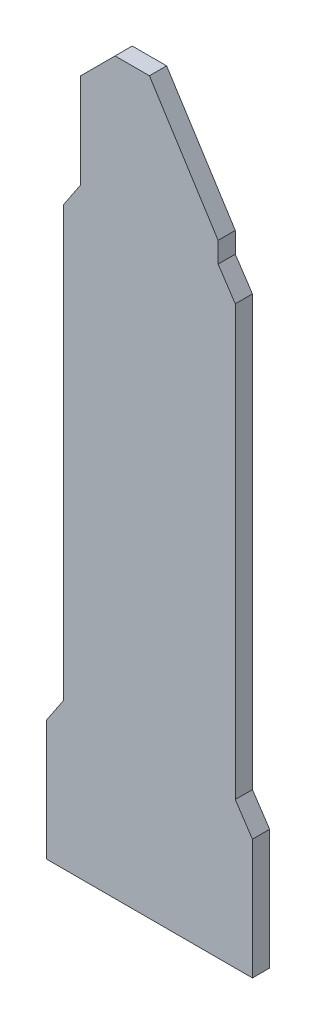
ISO-10303-21;
HEADER;
FILE_DESCRIPTION(('STEP AP214'),'2;1');
FILE_NAME('part.step','',(''),(''),'','','');
FILE_SCHEMA(('AUTOMOTIVE_DESIGN { 1 0 10303 214 1 1 1 1 }'));
ENDSEC;
DATA;
#1=APPLICATION_CONTEXT('core data for automotive mechanical design processes');
#2=APPLICATION_PROTOCOL_DEFINITION('international standard','automotive_design',2000,#1);
#3=PRODUCT_CONTEXT('',#1,'mechanical');
#4=PRODUCT('Part','Part','',(#3));
#5=PRODUCT_RELATED_PRODUCT_CATEGORY('part','',(#4));
#6=PRODUCT_DEFINITION_FORMATION('','',#4);
#7=PRODUCT_DEFINITION_CONTEXT('part definition',#1,'design');
#8=PRODUCT_DEFINITION('design','',#6,#7);
#9=PRODUCT_DEFINITION_SHAPE('','',#8);
#10=(LENGTH_UNIT() NAMED_UNIT(*) SI_UNIT(.MILLI.,.METRE.));
#11=(NAMED_UNIT(*) PLANE_ANGLE_UNIT() SI_UNIT($,.RADIAN.));
#12=(NAMED_UNIT(*) SI_UNIT($,.STERADIAN.) SOLID_ANGLE_UNIT());
#13=UNCERTAINTY_MEASURE_WITH_UNIT(LENGTH_MEASURE(1.E-05),#10,'distance_accuracy_value','');
#14=(GEOMETRIC_REPRESENTATION_CONTEXT(3) GLOBAL_UNCERTAINTY_ASSIGNED_CONTEXT((#13)) GLOBAL_UNIT_ASSIGNED_CONTEXT((#10,
#11,#12)) REPRESENTATION_CONTEXT('',''));
#15=CARTESIAN_POINT('',(0.,0.,0.));
#16=DIRECTION('',(0.,0.,1.));
#17=DIRECTION('',(1.,0.,0.));
#18=AXIS2_PLACEMENT_3D('',#15,#16,#17);
#19=CARTESIAN_POINT('',(1.27500000000002,1.25000000000002,0.1));
#20=DIRECTION('',(0.,0.,1.));
#21=DIRECTION('',(1.,0.,0.));
#22=AXIS2_PLACEMENT_3D('',#19,#20,#21);
#23=PLANE('',#22);
#24=DIRECTION('',(-0.554700196225227,-0.832050294337845,0.));
#25=VECTOR('',#24,1.);
#26=CARTESIAN_POINT('',(-2.125,2.35,0.1));
#27=LINE('',#26,#25);
#28=CARTESIAN_POINT('',(-2.125,2.35,0.1));
#29=VERTEX_POINT('',#28);
#30=CARTESIAN_POINT('',(-2.225,2.2,0.1));
#31=VERTEX_POINT('',#30);
#32=EDGE_CURVE('E130',#29,#31,#27,.T.);
#33=ORIENTED_EDGE('',*,*,#32,.T.);
#34=DIRECTION('',(0.,1.,0.));
#35=VECTOR('',#34,1.);
#36=CARTESIAN_POINT('',(-2.225,1.25000000000002,0.1));
#37=LINE('',#36,#35);
#38=CARTESIAN_POINT('',(-2.225,1.5,0.1));
#39=VERTEX_POINT('',#38);
#40=EDGE_CURVE('E115',#31,#39,#37,.F.);
#41=ORIENTED_EDGE('',*,*,#40,.T.);
#42=DIRECTION('',(1.,0.,0.));
#43=VECTOR('',#42,1.);
#44=CARTESIAN_POINT('',(1.27500000000002,1.5,0.1));
#45=LINE('',#44,#43);
#46=CARTESIAN_POINT('',(-1.025,1.5,0.1));
#47=VERTEX_POINT('',#46);
#48=EDGE_CURVE('E20',#39,#47,#45,.T.);
#49=ORIENTED_EDGE('',*,*,#48,.T.);
#50=DIRECTION('',(0.,1.,0.));
#51=VECTOR('',#50,1.);
#52=CARTESIAN_POINT('',(-1.025,1.25000000000002,0.1));
#53=LINE('',#52,#51);
#54=CARTESIAN_POINT('',(-1.025,2.2,0.1));
#55=VERTEX_POINT('',#54);
#56=EDGE_CURVE('E118',#47,#55,#53,.T.);
#57=ORIENTED_EDGE('',*,*,#56,.T.);
#58=DIRECTION('',(0.55470019622523,-0.832050294337843,0.));
#59=VECTOR('',#58,1.);
#60=CARTESIAN_POINT('',(-1.025,2.2,0.1));
#61=LINE('',#60,#59);
#62=CARTESIAN_POINT('',(-1.125,2.35,0.1));
#63=VERTEX_POINT('',#62);
#64=EDGE_CURVE('E134',#55,#63,#61,.F.);
#65=ORIENTED_EDGE('',*,*,#64,.T.);
#66=DIRECTION('',(0.,1.,0.));
#67=VECTOR('',#66,1.);
#68=CARTESIAN_POINT('',(-1.125,2.35,0.1));
#69=LINE('',#68,#67);
#70=CARTESIAN_POINT('',(-1.125,4.85,0.1));
#71=VERTEX_POINT('',#70);
#72=EDGE_CURVE('E139',#63,#71,#69,.T.);
#73=ORIENTED_EDGE('',*,*,#72,.T.);
#74=DIRECTION('',(0.554700196225235,-0.83205029433784,0.));
#75=VECTOR('',#74,1.);
#76=CARTESIAN_POINT('',(-1.225,5.,0.1));
#77=LINE('',#76,#75);
#78=CARTESIAN_POINT('',(-1.225,5.,0.1));
#79=VERTEX_POINT('',#78);
#80=EDGE_CURVE('E144',#71,#79,#77,.F.);
#81=ORIENTED_EDGE('',*,*,#80,.T.);
#82=DIRECTION('',(0.,1.,0.));
#83=VECTOR('',#82,1.);
#84=CARTESIAN_POINT('',(-1.225,5.75,0.1));
#85=LINE('',#84,#83);
#86=CARTESIAN_POINT('',(-1.225,5.12,0.1));
#87=VERTEX_POINT('',#86);
#88=EDGE_CURVE('E149',#79,#87,#85,.T.);
#89=ORIENTED_EDGE('',*,*,#88,.T.);
#90=DIRECTION('',(-0.536008136665273,0.844212815247804,0.));
#91=VECTOR('',#90,1.);
#92=CARTESIAN_POINT('',(-1.225,5.12,0.1));
#93=LINE('',#92,#91);
#94=CARTESIAN_POINT('',(-1.625,5.75,0.1));
#95=VERTEX_POINT('',#94);
#96=EDGE_CURVE('E152',#95,#87,#93,.F.);
#97=ORIENTED_EDGE('',*,*,#96,.F.);
#98=DIRECTION('',(1.,0.,0.));
#99=VECTOR('',#98,1.);
#100=CARTESIAN_POINT('',(-2.025,5.75,0.1));
#101=LINE('',#100,#99);
#102=CARTESIAN_POINT('',(-1.825,5.75,0.1));
#103=VERTEX_POINT('',#102);
#104=EDGE_CURVE('E159',#95,#103,#101,.F.);
#105=ORIENTED_EDGE('',*,*,#104,.T.);
#106=DIRECTION('',(0.707106781186548,0.707106781186547,0.));
#107=VECTOR('',#106,1.);
#108=CARTESIAN_POINT('',(-2.025,5.55,0.1));
#109=LINE('',#108,#107);
#110=CARTESIAN_POINT('',(-2.025,5.55,0.1));
#111=VERTEX_POINT('',#110);
#112=EDGE_CURVE('E164',#103,#111,#109,.F.);
#113=ORIENTED_EDGE('',*,*,#112,.T.);
#114=DIRECTION('',(0.,1.,0.));
#115=VECTOR('',#114,1.);
#116=CARTESIAN_POINT('',(-2.025,5.,0.1));
#117=LINE('',#116,#115);
#118=CARTESIAN_POINT('',(-2.025,5.,0.1));
#119=VERTEX_POINT('',#118);
#120=EDGE_CURVE('E169',#111,#119,#117,.F.);
#121=ORIENTED_EDGE('',*,*,#120,.T.);
#122=DIRECTION('',(0.55470019622523,0.832050294337843,0.));
#123=VECTOR('',#122,1.);
#124=CARTESIAN_POINT('',(-2.125,4.85,0.1));
#125=LINE('',#124,#123);
#126=CARTESIAN_POINT('',(-2.125,4.85,0.1));
#127=VERTEX_POINT('',#126);
#128=EDGE_CURVE('E174',#119,#127,#125,.F.);
#129=ORIENTED_EDGE('',*,*,#128,.T.);
#130=DIRECTION('',(0.,1.,0.));
#131=VECTOR('',#130,1.);
#132=CARTESIAN_POINT('',(-2.125,4.85,0.1));
#133=LINE('',#132,#131);
#134=EDGE_CURVE('E179',#127,#29,#133,.F.);
#135=ORIENTED_EDGE('',*,*,#134,.T.);
#136=EDGE_LOOP('',(#33,#41,#49,#57,#65,#73,#81,#89,#97,#105,#113,#121,#129,#135));
#137=FACE_BOUND('',#136,.T.);
#138=ADVANCED_FACE('F17',(#137),#23,.T.);
#139=CARTESIAN_POINT('',(-1.025,2.2,0.1));
#140=DIRECTION('',(-0.832050294337843,-0.55470019622523,0.));
#141=DIRECTION('',(0.55470019622523,-0.832050294337843,0.));
#142=AXIS2_PLACEMENT_3D('',#139,#140,#141);
#143=PLANE('',#142);
#144=DIRECTION('',(0.,0.,1.));
#145=VECTOR('',#144,1.);
#146=CARTESIAN_POINT('',(-1.125,2.35,0.1));
#147=LINE('',#146,#145);
#148=CARTESIAN_POINT('',(-1.125,2.35,0.));
#149=VERTEX_POINT('',#148);
#150=EDGE_CURVE('E136',#149,#63,#147,.T.);
#151=ORIENTED_EDGE('',*,*,#150,.T.);
#152=ORIENTED_EDGE('',*,*,#64,.F.);
#153=DIRECTION('',(0.,0.,1.));
#154=VECTOR('',#153,1.);
#155=CARTESIAN_POINT('',(-1.025,2.2,0.1));
#156=LINE('',#155,#154);
#157=CARTESIAN_POINT('',(-1.025,2.2,0.));
#158=VERTEX_POINT('',#157);
#159=EDGE_CURVE('E125',#55,#158,#156,.F.);
#160=ORIENTED_EDGE('',*,*,#159,.T.);
#161=DIRECTION('',(-0.55470019622523,0.832050294337843,0.));
#162=VECTOR('',#161,1.);
#163=CARTESIAN_POINT('',(-1.025,2.2,0.));
#164=LINE('',#163,#162);
#165=EDGE_CURVE('E124',#158,#149,#164,.T.);
#166=ORIENTED_EDGE('',*,*,#165,.T.);
#167=EDGE_LOOP('',(#151,#152,#160,#166));
#168=FACE_BOUND('',#167,.T.);
#169=ADVANCED_FACE('F271',(#168),#143,.F.);
#170=CARTESIAN_POINT('',(-1.125,2.35,0.1));
#171=DIRECTION('',(-1.,0.,0.));
#172=DIRECTION('',(0.,0.,1.));
#173=AXIS2_PLACEMENT_3D('',#170,#171,#172);
#174=PLANE('',#173);
#175=DIRECTION('',(0.,0.,1.));
#176=VECTOR('',#175,1.);
#177=CARTESIAN_POINT('',(-1.125,4.85,0.1));
#178=LINE('',#177,#176);
#179=CARTESIAN_POINT('',(-1.125,4.85,0.));
#180=VERTEX_POINT('',#179);
#181=EDGE_CURVE('E141',#180,#71,#178,.T.);
#182=ORIENTED_EDGE('',*,*,#181,.T.);
#183=ORIENTED_EDGE('',*,*,#72,.F.);
#184=ORIENTED_EDGE('',*,*,#150,.F.);
#185=DIRECTION('',(0.,1.,0.));
#186=VECTOR('',#185,1.);
#187=CARTESIAN_POINT('',(-1.125,1.25000000000002,0.));
#188=LINE('',#187,#186);
#189=EDGE_CURVE('E193',#149,#180,#188,.T.);
#190=ORIENTED_EDGE('',*,*,#189,.T.);
#191=EDGE_LOOP('',(#182,#183,#184,#190));
#192=FACE_BOUND('',#191,.T.);
#193=ADVANCED_FACE('F269',(#192),#174,.F.);
#194=CARTESIAN_POINT('',(-1.225,5.,0.1));
#195=DIRECTION('',(-0.83205029433784,-0.554700196225235,0.));
#196=DIRECTION('',(0.554700196225235,-0.83205029433784,0.));
#197=AXIS2_PLACEMENT_3D('',#194,#195,#196);
#198=PLANE('',#197);
#199=DIRECTION('',(0.,0.,1.));
#200=VECTOR('',#199,1.);
#201=CARTESIAN_POINT('',(-1.225,5.,0.1));
#202=LINE('',#201,#200);
#203=CARTESIAN_POINT('',(-1.225,5.,0.));
#204=VERTEX_POINT('',#203);
#205=EDGE_CURVE('E146',#204,#79,#202,.T.);
#206=ORIENTED_EDGE('',*,*,#205,.T.);
#207=ORIENTED_EDGE('',*,*,#80,.F.);
#208=ORIENTED_EDGE('',*,*,#181,.F.);
#209=DIRECTION('',(-0.554700196225229,0.832050294337844,0.));
#210=VECTOR('',#209,1.);
#211=CARTESIAN_POINT('',(-1.125,4.85,0.));
#212=LINE('',#211,#210);
#213=EDGE_CURVE('E196',#180,#204,#212,.T.);
#214=ORIENTED_EDGE('',*,*,#213,.T.);
#215=EDGE_LOOP('',(#206,#207,#208,#214));
#216=FACE_BOUND('',#215,.T.);
#217=ADVANCED_FACE('F265',(#216),#198,.F.);
#218=CARTESIAN_POINT('',(-1.225,5.75,0.1));
#219=DIRECTION('',(-1.,0.,0.));
#220=DIRECTION('',(0.,0.,1.));
#221=AXIS2_PLACEMENT_3D('',#218,#219,#220);
#222=PLANE('',#221);
#223=ORIENTED_EDGE('',*,*,#88,.F.);
#224=ORIENTED_EDGE('',*,*,#205,.F.);
#225=DIRECTION('',(0.,1.,0.));
#226=VECTOR('',#225,1.);
#227=CARTESIAN_POINT('',(-1.225,1.25000000000002,0.));
#228=LINE('',#227,#226);
#229=CARTESIAN_POINT('',(-1.225,5.12,0.));
#230=VERTEX_POINT('',#229);
#231=EDGE_CURVE('E199',#204,#230,#228,.T.);
#232=ORIENTED_EDGE('',*,*,#231,.T.);
#233=DIRECTION('',(0.,0.,1.));
#234=VECTOR('',#233,1.);
#235=CARTESIAN_POINT('',(-1.225,5.12,-6.25));
#236=LINE('',#235,#234);
#237=EDGE_CURVE('E154',#87,#230,#236,.F.);
#238=ORIENTED_EDGE('',*,*,#237,.F.);
#239=EDGE_LOOP('',(#223,#224,#232,#238));
#240=FACE_BOUND('',#239,.T.);
#241=ADVANCED_FACE('F261',(#240),#222,.F.);
#242=CARTESIAN_POINT('',(-1.225,5.12,-6.25));
#243=DIRECTION('',(0.844212815247804,0.536008136665273,0.));
#244=DIRECTION('',(-0.536008136665273,0.844212815247804,0.));
#245=AXIS2_PLACEMENT_3D('',#242,#243,#244);
#246=PLANE('',#245);
#247=ORIENTED_EDGE('',*,*,#96,.T.);
#248=ORIENTED_EDGE('',*,*,#237,.T.);
#249=DIRECTION('',(-0.536008136665272,0.844212815247804,0.));
#250=VECTOR('',#249,1.);
#251=CARTESIAN_POINT('',(-1.225,5.12,0.));
#252=LINE('',#251,#250);
#253=CARTESIAN_POINT('',(-1.625,5.75,0.));
#254=VERTEX_POINT('',#253);
#255=EDGE_CURVE('E202',#230,#254,#252,.T.);
#256=ORIENTED_EDGE('',*,*,#255,.T.);
#257=DIRECTION('',(0.,0.,-1.));
#258=VECTOR('',#257,1.);
#259=CARTESIAN_POINT('',(-1.625,5.75,0.1));
#260=LINE('',#259,#258);
#261=EDGE_CURVE('E156',#254,#95,#260,.F.);
#262=ORIENTED_EDGE('',*,*,#261,.T.);
#263=EDGE_LOOP('',(#247,#248,#256,#262));
#264=FACE_BOUND('',#263,.T.);
#265=ADVANCED_FACE('F257',(#264),#246,.T.);
#266=CARTESIAN_POINT('',(-2.025,5.75,0.1));
#267=DIRECTION('',(0.,-1.,0.));
#268=DIRECTION('',(0.,0.,-1.));
#269=AXIS2_PLACEMENT_3D('',#266,#267,#268);
#270=PLANE('',#269);
#271=DIRECTION('',(0.,0.,1.));
#272=VECTOR('',#271,1.);
#273=CARTESIAN_POINT('',(-1.825,5.75,0.1));
#274=LINE('',#273,#272);
#275=CARTESIAN_POINT('',(-1.825,5.75,0.));
#276=VERTEX_POINT('',#275);
#277=EDGE_CURVE('E161',#276,#103,#274,.T.);
#278=ORIENTED_EDGE('',*,*,#277,.T.);
#279=ORIENTED_EDGE('',*,*,#104,.F.);
#280=ORIENTED_EDGE('',*,*,#261,.F.);
#281=DIRECTION('',(1.,0.,0.));
#282=VECTOR('',#281,1.);
#283=CARTESIAN_POINT('',(1.27500000000002,5.75,0.));
#284=LINE('',#283,#282);
#285=EDGE_CURVE('E205',#254,#276,#284,.F.);
#286=ORIENTED_EDGE('',*,*,#285,.T.);
#287=EDGE_LOOP('',(#278,#279,#280,#286));
#288=FACE_BOUND('',#287,.T.);
#289=ADVANCED_FACE('F253',(#288),#270,.F.);
#290=CARTESIAN_POINT('',(-2.025,5.55,0.1));
#291=DIRECTION('',(0.707106781186547,-0.707106781186548,0.));
#292=DIRECTION('',(0.707106781186548,0.707106781186547,0.));
#293=AXIS2_PLACEMENT_3D('',#290,#291,#292);
#294=PLANE('',#293);
#295=ORIENTED_EDGE('',*,*,#277,.F.);
#296=DIRECTION('',(-0.707106781186548,-0.707106781186547,0.));
#297=VECTOR('',#296,1.);
#298=CARTESIAN_POINT('',(-1.825,5.75,0.));
#299=LINE('',#298,#297);
#300=CARTESIAN_POINT('',(-2.025,5.55,0.));
#301=VERTEX_POINT('',#300);
#302=EDGE_CURVE('E208',#276,#301,#299,.T.);
#303=ORIENTED_EDGE('',*,*,#302,.T.);
#304=DIRECTION('',(0.,0.,-1.));
#305=VECTOR('',#304,1.);
#306=CARTESIAN_POINT('',(-2.025,5.55,0.1));
#307=LINE('',#306,#305);
#308=EDGE_CURVE('E166',#301,#111,#307,.F.);
#309=ORIENTED_EDGE('',*,*,#308,.T.);
#310=ORIENTED_EDGE('',*,*,#112,.F.);
#311=EDGE_LOOP('',(#295,#303,#309,#310));
#312=FACE_BOUND('',#311,.T.);
#313=ADVANCED_FACE('F249',(#312),#294,.F.);
#314=CARTESIAN_POINT('',(-2.025,5.,0.1));
#315=DIRECTION('',(1.,0.,0.));
#316=DIRECTION('',(0.,0.,-1.));
#317=AXIS2_PLACEMENT_3D('',#314,#315,#316);
#318=PLANE('',#317);
#319=ORIENTED_EDGE('',*,*,#308,.F.);
#320=DIRECTION('',(0.,1.,0.));
#321=VECTOR('',#320,1.);
#322=CARTESIAN_POINT('',(-2.025,1.25000000000002,0.));
#323=LINE('',#322,#321);
#324=CARTESIAN_POINT('',(-2.025,5.,0.));
#325=VERTEX_POINT('',#324);
#326=EDGE_CURVE('E211',#301,#325,#323,.F.);
#327=ORIENTED_EDGE('',*,*,#326,.T.);
#328=DIRECTION('',(0.,0.,1.));
#329=VECTOR('',#328,1.);
#330=CARTESIAN_POINT('',(-2.025,5.,0.1));
#331=LINE('',#330,#329);
#332=EDGE_CURVE('E171',#325,#119,#331,.T.);
#333=ORIENTED_EDGE('',*,*,#332,.T.);
#334=ORIENTED_EDGE('',*,*,#120,.F.);
#335=EDGE_LOOP('',(#319,#327,#333,#334));
#336=FACE_BOUND('',#335,.T.);
#337=ADVANCED_FACE('F245',(#336),#318,.F.);
#338=CARTESIAN_POINT('',(-2.125,4.85,0.1));
#339=DIRECTION('',(0.832050294337843,-0.55470019622523,0.));
#340=DIRECTION('',(0.55470019622523,0.832050294337843,0.));
#341=AXIS2_PLACEMENT_3D('',#338,#339,#340);
#342=PLANE('',#341);
#343=DIRECTION('',(0.,0.,1.));
#344=VECTOR('',#343,1.);
#345=CARTESIAN_POINT('',(-2.125,4.85,0.1));
#346=LINE('',#345,#344);
#347=CARTESIAN_POINT('',(-2.125,4.85,0.));
#348=VERTEX_POINT('',#347);
#349=EDGE_CURVE('E176',#348,#127,#346,.T.);
#350=ORIENTED_EDGE('',*,*,#349,.T.);
#351=ORIENTED_EDGE('',*,*,#128,.F.);
#352=ORIENTED_EDGE('',*,*,#332,.F.);
#353=DIRECTION('',(-0.55470019622523,-0.832050294337843,0.));
#354=VECTOR('',#353,1.);
#355=CARTESIAN_POINT('',(-2.025,5.,0.));
#356=LINE('',#355,#354);
#357=EDGE_CURVE('E214',#325,#348,#356,.T.);
#358=ORIENTED_EDGE('',*,*,#357,.T.);
#359=EDGE_LOOP('',(#350,#351,#352,#358));
#360=FACE_BOUND('',#359,.T.);
#361=ADVANCED_FACE('F241',(#360),#342,.F.);
#362=CARTESIAN_POINT('',(-2.125,4.85,0.1));
#363=DIRECTION('',(1.,0.,0.));
#364=DIRECTION('',(0.,1.,0.));
#365=AXIS2_PLACEMENT_3D('',#362,#363,#364);
#366=PLANE('',#365);
#367=DIRECTION('',(0.,0.,1.));
#368=VECTOR('',#367,1.);
#369=CARTESIAN_POINT('',(-2.125,2.35,0.1));
#370=LINE('',#369,#368);
#371=CARTESIAN_POINT('',(-2.125,2.35,0.));
#372=VERTEX_POINT('',#371);
#373=EDGE_CURVE('E182',#372,#29,#370,.T.);
#374=ORIENTED_EDGE('',*,*,#373,.T.);
#375=ORIENTED_EDGE('',*,*,#134,.F.);
#376=ORIENTED_EDGE('',*,*,#349,.F.);
#377=DIRECTION('',(0.,1.,0.));
#378=VECTOR('',#377,1.);
#379=CARTESIAN_POINT('',(-2.125,1.25000000000002,0.));
#380=LINE('',#379,#378);
#381=EDGE_CURVE('E217',#348,#372,#380,.F.);
#382=ORIENTED_EDGE('',*,*,#381,.T.);
#383=EDGE_LOOP('',(#374,#375,#376,#382));
#384=FACE_BOUND('',#383,.T.);
#385=ADVANCED_FACE('F237',(#384),#366,.F.);
#386=CARTESIAN_POINT('',(-2.125,2.35,0.1));
#387=DIRECTION('',(0.832050294337841,-0.554700196225233,0.));
#388=DIRECTION('',(0.554700196225233,0.832050294337841,0.));
#389=AXIS2_PLACEMENT_3D('',#386,#387,#388);
#390=PLANE('',#389);
#391=DIRECTION('',(0.,0.,1.));
#392=VECTOR('',#391,1.);
#393=CARTESIAN_POINT('',(-2.225,2.2,0.1));
#394=LINE('',#393,#392);
#395=CARTESIAN_POINT('',(-2.225,2.2,0.));
#396=VERTEX_POINT('',#395);
#397=EDGE_CURVE('E185',#396,#31,#394,.T.);
#398=ORIENTED_EDGE('',*,*,#397,.T.);
#399=ORIENTED_EDGE('',*,*,#32,.F.);
#400=ORIENTED_EDGE('',*,*,#373,.F.);
#401=DIRECTION('',(-0.554700196225227,-0.832050294337845,0.));
#402=VECTOR('',#401,1.);
#403=CARTESIAN_POINT('',(-2.125,2.35,0.));
#404=LINE('',#403,#402);
#405=EDGE_CURVE('E220',#372,#396,#404,.T.);
#406=ORIENTED_EDGE('',*,*,#405,.T.);
#407=EDGE_LOOP('',(#398,#399,#400,#406));
#408=FACE_BOUND('',#407,.T.);
#409=ADVANCED_FACE('F234',(#408),#390,.F.);
#410=CARTESIAN_POINT('',(-2.225,2.2,0.1));
#411=DIRECTION('',(1.,0.,0.));
#412=DIRECTION('',(0.,1.,0.));
#413=AXIS2_PLACEMENT_3D('',#410,#411,#412);
#414=PLANE('',#413);
#415=DIRECTION('',(0.,0.,1.));
#416=VECTOR('',#415,1.);
#417=CARTESIAN_POINT('',(-2.225,1.5,-0.359021698729691));
#418=LINE('',#417,#416);
#419=CARTESIAN_POINT('',(-2.225,1.5,0.));
#420=VERTEX_POINT('',#419);
#421=EDGE_CURVE('E188',#420,#39,#418,.T.);
#422=ORIENTED_EDGE('',*,*,#421,.T.);
#423=ORIENTED_EDGE('',*,*,#40,.F.);
#424=ORIENTED_EDGE('',*,*,#397,.F.);
#425=DIRECTION('',(0.,1.,0.));
#426=VECTOR('',#425,1.);
#427=CARTESIAN_POINT('',(-2.225,1.25000000000002,0.));
#428=LINE('',#427,#426);
#429=EDGE_CURVE('E223',#396,#420,#428,.F.);
#430=ORIENTED_EDGE('',*,*,#429,.T.);
#431=EDGE_LOOP('',(#422,#423,#424,#430));
#432=FACE_BOUND('',#431,.T.);
#433=ADVANCED_FACE('F228',(#432),#414,.F.);
#434=CARTESIAN_POINT('',(3.1539367816092,1.5,-0.359021698729691));
#435=DIRECTION('',(0.,1.,0.));
#436=DIRECTION('',(0.,0.,1.));
#437=AXIS2_PLACEMENT_3D('',#434,#435,#436);
#438=PLANE('',#437);
#439=DIRECTION('',(0.,0.,1.));
#440=VECTOR('',#439,1.);
#441=CARTESIAN_POINT('',(-1.025,1.5,0.1));
#442=LINE('',#441,#440);
#443=CARTESIAN_POINT('',(-1.025,1.5,0.));
#444=VERTEX_POINT('',#443);
#445=EDGE_CURVE('E34',#444,#47,#442,.T.);
#446=ORIENTED_EDGE('',*,*,#445,.T.);
#447=ORIENTED_EDGE('',*,*,#48,.F.);
#448=ORIENTED_EDGE('',*,*,#421,.F.);
#449=DIRECTION('',(1.,0.,0.));
#450=VECTOR('',#449,1.);
#451=CARTESIAN_POINT('',(1.27500000000002,1.5,0.));
#452=LINE('',#451,#450);
#453=EDGE_CURVE('E26',#420,#444,#452,.T.);
#454=ORIENTED_EDGE('',*,*,#453,.T.);
#455=EDGE_LOOP('',(#446,#447,#448,#454));
#456=FACE_BOUND('',#455,.T.);
#457=ADVANCED_FACE('F122',(#456),#438,.F.);
#458=CARTESIAN_POINT('',(-1.025,-0.15,0.1));
#459=DIRECTION('',(-1.,0.,0.));
#460=DIRECTION('',(0.,-1.,0.));
#461=AXIS2_PLACEMENT_3D('',#458,#459,#460);
#462=PLANE('',#461);
#463=ORIENTED_EDGE('',*,*,#445,.F.);
#464=DIRECTION('',(0.,1.,0.));
#465=VECTOR('',#464,1.);
#466=CARTESIAN_POINT('',(-1.025,1.25000000000002,0.));
#467=LINE('',#466,#465);
#468=EDGE_CURVE('E11',#444,#158,#467,.T.);
#469=ORIENTED_EDGE('',*,*,#468,.T.);
#470=ORIENTED_EDGE('',*,*,#159,.F.);
#471=ORIENTED_EDGE('',*,*,#56,.F.);
#472=EDGE_LOOP('',(#463,#469,#470,#471));
#473=FACE_BOUND('',#472,.T.);
#474=ADVANCED_FACE('F128',(#473),#462,.F.);
#475=CARTESIAN_POINT('',(1.27500000000002,1.25000000000002,0.));
#476=DIRECTION('',(0.,0.,1.));
#477=DIRECTION('',(1.,0.,0.));
#478=AXIS2_PLACEMENT_3D('',#475,#476,#477);
#479=PLANE('',#478);
#480=ORIENTED_EDGE('',*,*,#453,.F.);
#481=ORIENTED_EDGE('',*,*,#429,.F.);
#482=ORIENTED_EDGE('',*,*,#405,.F.);
#483=ORIENTED_EDGE('',*,*,#381,.F.);
#484=ORIENTED_EDGE('',*,*,#357,.F.);
#485=ORIENTED_EDGE('',*,*,#326,.F.);
#486=ORIENTED_EDGE('',*,*,#302,.F.);
#487=ORIENTED_EDGE('',*,*,#285,.F.);
#488=ORIENTED_EDGE('',*,*,#255,.F.);
#489=ORIENTED_EDGE('',*,*,#231,.F.);
#490=ORIENTED_EDGE('',*,*,#213,.F.);
#491=ORIENTED_EDGE('',*,*,#189,.F.);
#492=ORIENTED_EDGE('',*,*,#165,.F.);
#493=ORIENTED_EDGE('',*,*,#468,.F.);
#494=EDGE_LOOP('',(#480,#481,#482,#483,#484,#485,#486,#487,#488,#489,#490,#491,#492,#493));
#495=FACE_BOUND('',#494,.T.);
#496=ADVANCED_FACE('F231',(#495),#479,.F.);
#497=CLOSED_SHELL('',(#138,#169,#193,#217,#241,#265,#289,#313,#337,#361,#385,#409,#433,#457,
#474,#496));
#498=MANIFOLD_SOLID_BREP('B1',#497);
#499=ADVANCED_BREP_SHAPE_REPRESENTATION('',(#18,#498),#14);
#500=SHAPE_DEFINITION_REPRESENTATION(#9,#499);
ENDSEC;
END-ISO-10303-21;
